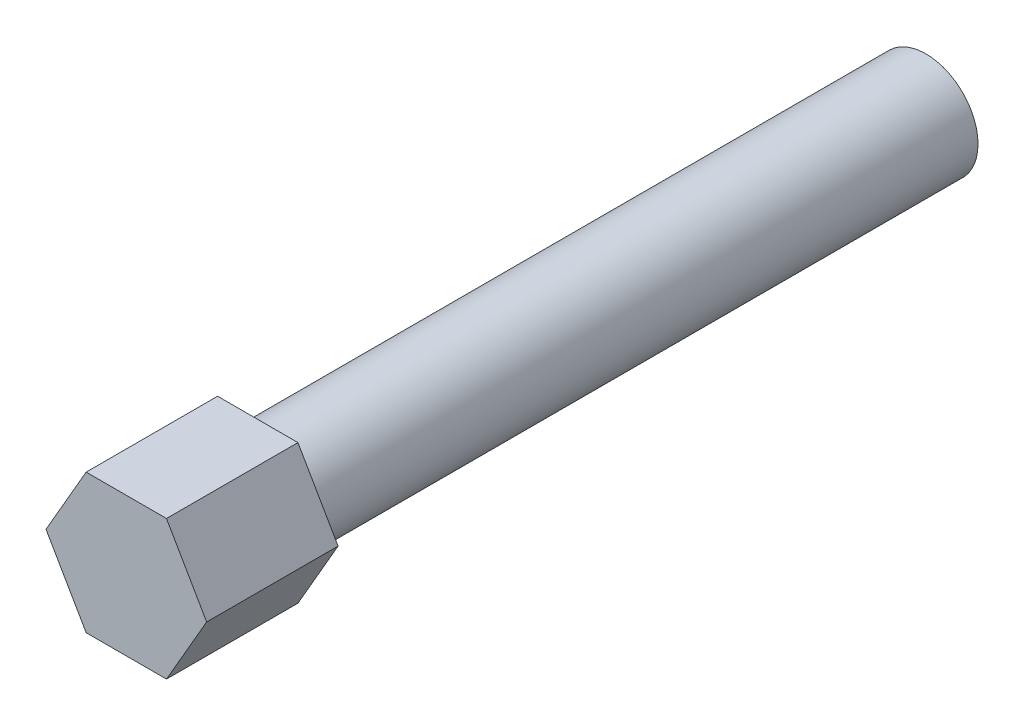
ISO-10303-21;
HEADER;
FILE_DESCRIPTION(('STEP AP214'),'2;1');
FILE_NAME('part.step','',(''),(''),'','','');
FILE_SCHEMA(('AUTOMOTIVE_DESIGN { 1 0 10303 214 1 1 1 1 }'));
ENDSEC;
DATA;
#1=APPLICATION_CONTEXT('core data for automotive mechanical design processes');
#2=APPLICATION_PROTOCOL_DEFINITION('international standard','automotive_design',2000,#1);
#3=PRODUCT_CONTEXT('',#1,'mechanical');
#4=PRODUCT('Part','Part','',(#3));
#5=PRODUCT_RELATED_PRODUCT_CATEGORY('part','',(#4));
#6=PRODUCT_DEFINITION_FORMATION('','',#4);
#7=PRODUCT_DEFINITION_CONTEXT('part definition',#1,'design');
#8=PRODUCT_DEFINITION('design','',#6,#7);
#9=PRODUCT_DEFINITION_SHAPE('','',#8);
#10=(LENGTH_UNIT() NAMED_UNIT(*) SI_UNIT(.MILLI.,.METRE.));
#11=(NAMED_UNIT(*) PLANE_ANGLE_UNIT() SI_UNIT($,.RADIAN.));
#12=(NAMED_UNIT(*) SI_UNIT($,.STERADIAN.) SOLID_ANGLE_UNIT());
#13=UNCERTAINTY_MEASURE_WITH_UNIT(LENGTH_MEASURE(1.E-05),#10,'distance_accuracy_value','');
#14=(GEOMETRIC_REPRESENTATION_CONTEXT(3) GLOBAL_UNCERTAINTY_ASSIGNED_CONTEXT((#13)) GLOBAL_UNIT_ASSIGNED_CONTEXT((#10,
#11,#12)) REPRESENTATION_CONTEXT('',''));
#15=CARTESIAN_POINT('',(0.,0.,0.));
#16=DIRECTION('',(0.,0.,1.));
#17=DIRECTION('',(1.,0.,0.));
#18=AXIS2_PLACEMENT_3D('',#15,#16,#17);
#19=CARTESIAN_POINT('',(-3.66617420935412,-6.35,12.));
#20=DIRECTION('',(0.,1.,0.));
#21=DIRECTION('',(-1.,0.,0.));
#22=AXIS2_PLACEMENT_3D('',#19,#20,#21);
#23=PLANE('',#22);
#24=DIRECTION('',(1.,0.,0.));
#25=VECTOR('',#24,1.);
#26=CARTESIAN_POINT('',(-3.66617420935412,-6.35,0.));
#27=LINE('',#26,#25);
#28=CARTESIAN_POINT('',(-3.66617420935412,-6.35,0.));
#29=VERTEX_POINT('',#28);
#30=CARTESIAN_POINT('',(3.66617420935412,-6.35,0.));
#31=VERTEX_POINT('',#30);
#32=EDGE_CURVE('E148',#29,#31,#27,.T.);
#33=ORIENTED_EDGE('',*,*,#32,.T.);
#34=DIRECTION('',(0.,0.,-1.));
#35=VECTOR('',#34,1.);
#36=CARTESIAN_POINT('',(3.66617420935412,-6.35,12.));
#37=LINE('',#36,#35);
#38=CARTESIAN_POINT('',(3.66617420935412,-6.35,12.));
#39=VERTEX_POINT('',#38);
#40=EDGE_CURVE('E48',#39,#31,#37,.T.);
#41=ORIENTED_EDGE('',*,*,#40,.F.);
#42=DIRECTION('',(1.,0.,0.));
#43=VECTOR('',#42,1.);
#44=CARTESIAN_POINT('',(-3.66617420935412,-6.35,12.));
#45=LINE('',#44,#43);
#46=CARTESIAN_POINT('',(-3.66617420935412,-6.35,12.));
#47=VERTEX_POINT('',#46);
#48=EDGE_CURVE('E166',#47,#39,#45,.T.);
#49=ORIENTED_EDGE('',*,*,#48,.F.);
#50=DIRECTION('',(0.,0.,-1.));
#51=VECTOR('',#50,1.);
#52=CARTESIAN_POINT('',(-3.66617420935412,-6.35,12.));
#53=LINE('',#52,#51);
#54=EDGE_CURVE('E144',#47,#29,#53,.T.);
#55=ORIENTED_EDGE('',*,*,#54,.T.);
#56=EDGE_LOOP('',(#33,#41,#49,#55));
#57=FACE_BOUND('',#56,.T.);
#58=ADVANCED_FACE('F45',(#57),#23,.F.);
#59=CARTESIAN_POINT('',(3.66617420935412,-6.35,12.));
#60=DIRECTION('',(-0.866025403784438,0.5,0.));
#61=DIRECTION('',(-0.5,-0.866025403784439,0.));
#62=AXIS2_PLACEMENT_3D('',#59,#60,#61);
#63=PLANE('',#62);
#64=DIRECTION('',(0.5,0.866025403784439,0.));
#65=VECTOR('',#64,1.);
#66=CARTESIAN_POINT('',(3.66617420935412,-6.35,0.));
#67=LINE('',#66,#65);
#68=CARTESIAN_POINT('',(7.33234841870825,0.,0.));
#69=VERTEX_POINT('',#68);
#70=EDGE_CURVE('E152',#31,#69,#67,.T.);
#71=ORIENTED_EDGE('',*,*,#70,.T.);
#72=DIRECTION('',(0.,0.,-1.));
#73=VECTOR('',#72,1.);
#74=CARTESIAN_POINT('',(7.33234841870825,0.,12.));
#75=LINE('',#74,#73);
#76=CARTESIAN_POINT('',(7.33234841870825,0.,12.));
#77=VERTEX_POINT('',#76);
#78=EDGE_CURVE('E172',#77,#69,#75,.T.);
#79=ORIENTED_EDGE('',*,*,#78,.F.);
#80=DIRECTION('',(0.5,0.866025403784439,0.));
#81=VECTOR('',#80,1.);
#82=CARTESIAN_POINT('',(3.66617420935412,-6.35,12.));
#83=LINE('',#82,#81);
#84=EDGE_CURVE('E106',#39,#77,#83,.T.);
#85=ORIENTED_EDGE('',*,*,#84,.F.);
#86=ORIENTED_EDGE('',*,*,#40,.T.);
#87=EDGE_LOOP('',(#71,#79,#85,#86));
#88=FACE_BOUND('',#87,.T.);
#89=ADVANCED_FACE('F179',(#88),#63,.F.);
#90=CARTESIAN_POINT('',(7.33234841870825,0.,12.));
#91=DIRECTION('',(-0.866025403784439,-0.5,0.));
#92=DIRECTION('',(0.5,-0.866025403784439,0.));
#93=AXIS2_PLACEMENT_3D('',#90,#91,#92);
#94=PLANE('',#93);
#95=DIRECTION('',(-0.5,0.866025403784439,0.));
#96=VECTOR('',#95,1.);
#97=CARTESIAN_POINT('',(7.33234841870825,0.,0.));
#98=LINE('',#97,#96);
#99=CARTESIAN_POINT('',(3.66617420935412,6.35,0.));
#100=VERTEX_POINT('',#99);
#101=EDGE_CURVE('E156',#69,#100,#98,.T.);
#102=ORIENTED_EDGE('',*,*,#101,.T.);
#103=DIRECTION('',(0.,0.,-1.));
#104=VECTOR('',#103,1.);
#105=CARTESIAN_POINT('',(3.66617420935412,6.35,12.));
#106=LINE('',#105,#104);
#107=CARTESIAN_POINT('',(3.66617420935412,6.35,12.));
#108=VERTEX_POINT('',#107);
#109=EDGE_CURVE('E137',#108,#100,#106,.T.);
#110=ORIENTED_EDGE('',*,*,#109,.F.);
#111=DIRECTION('',(-0.5,0.866025403784439,0.));
#112=VECTOR('',#111,1.);
#113=CARTESIAN_POINT('',(7.33234841870825,0.,12.));
#114=LINE('',#113,#112);
#115=EDGE_CURVE('E123',#77,#108,#114,.T.);
#116=ORIENTED_EDGE('',*,*,#115,.F.);
#117=ORIENTED_EDGE('',*,*,#78,.T.);
#118=EDGE_LOOP('',(#102,#110,#116,#117));
#119=FACE_BOUND('',#118,.T.);
#120=ADVANCED_FACE('F185',(#119),#94,.F.);
#121=CARTESIAN_POINT('',(3.66617420935412,6.35,12.));
#122=DIRECTION('',(0.,-1.,0.));
#123=DIRECTION('',(1.,0.,0.));
#124=AXIS2_PLACEMENT_3D('',#121,#122,#123);
#125=PLANE('',#124);
#126=DIRECTION('',(-1.,0.,0.));
#127=VECTOR('',#126,1.);
#128=CARTESIAN_POINT('',(3.66617420935412,6.35,0.));
#129=LINE('',#128,#127);
#130=CARTESIAN_POINT('',(-3.66617420935412,6.35,0.));
#131=VERTEX_POINT('',#130);
#132=EDGE_CURVE('E133',#100,#131,#129,.T.);
#133=ORIENTED_EDGE('',*,*,#132,.T.);
#134=DIRECTION('',(0.,0.,-1.));
#135=VECTOR('',#134,1.);
#136=CARTESIAN_POINT('',(-3.66617420935412,6.35,12.));
#137=LINE('',#136,#135);
#138=CARTESIAN_POINT('',(-3.66617420935412,6.35,12.));
#139=VERTEX_POINT('',#138);
#140=EDGE_CURVE('E130',#139,#131,#137,.T.);
#141=ORIENTED_EDGE('',*,*,#140,.F.);
#142=DIRECTION('',(-1.,0.,0.));
#143=VECTOR('',#142,1.);
#144=CARTESIAN_POINT('',(3.66617420935412,6.35,12.));
#145=LINE('',#144,#143);
#146=EDGE_CURVE('E116',#108,#139,#145,.T.);
#147=ORIENTED_EDGE('',*,*,#146,.F.);
#148=ORIENTED_EDGE('',*,*,#109,.T.);
#149=EDGE_LOOP('',(#133,#141,#147,#148));
#150=FACE_BOUND('',#149,.T.);
#151=ADVANCED_FACE('F131',(#150),#125,.F.);
#152=CARTESIAN_POINT('',(-3.66617420935412,6.35,12.));
#153=DIRECTION('',(0.866025403784439,-0.5,0.));
#154=DIRECTION('',(0.5,0.866025403784439,0.));
#155=AXIS2_PLACEMENT_3D('',#152,#153,#154);
#156=PLANE('',#155);
#157=DIRECTION('',(-0.5,-0.866025403784439,0.));
#158=VECTOR('',#157,1.);
#159=CARTESIAN_POINT('',(-3.66617420935412,6.35,0.));
#160=LINE('',#159,#158);
#161=CARTESIAN_POINT('',(-7.33234841870825,0.,0.));
#162=VERTEX_POINT('',#161);
#163=EDGE_CURVE('E161',#131,#162,#160,.T.);
#164=ORIENTED_EDGE('',*,*,#163,.T.);
#165=DIRECTION('',(0.,0.,-1.));
#166=VECTOR('',#165,1.);
#167=CARTESIAN_POINT('',(-7.33234841870825,0.,12.));
#168=LINE('',#167,#166);
#169=CARTESIAN_POINT('',(-7.33234841870825,0.,12.));
#170=VERTEX_POINT('',#169);
#171=EDGE_CURVE('E138',#170,#162,#168,.T.);
#172=ORIENTED_EDGE('',*,*,#171,.F.);
#173=DIRECTION('',(-0.5,-0.866025403784439,0.));
#174=VECTOR('',#173,1.);
#175=CARTESIAN_POINT('',(-3.66617420935412,6.35,12.));
#176=LINE('',#175,#174);
#177=EDGE_CURVE('E120',#139,#170,#176,.T.);
#178=ORIENTED_EDGE('',*,*,#177,.F.);
#179=ORIENTED_EDGE('',*,*,#140,.T.);
#180=EDGE_LOOP('',(#164,#172,#178,#179));
#181=FACE_BOUND('',#180,.T.);
#182=ADVANCED_FACE('F140',(#181),#156,.F.);
#183=CARTESIAN_POINT('',(-7.33234841870825,0.,12.));
#184=DIRECTION('',(0.866025403784439,0.5,0.));
#185=DIRECTION('',(-0.5,0.866025403784439,0.));
#186=AXIS2_PLACEMENT_3D('',#183,#184,#185);
#187=PLANE('',#186);
#188=DIRECTION('',(0.5,-0.866025403784439,0.));
#189=VECTOR('',#188,1.);
#190=CARTESIAN_POINT('',(-7.33234841870825,0.,0.));
#191=LINE('',#190,#189);
#192=EDGE_CURVE('E97',#162,#29,#191,.T.);
#193=ORIENTED_EDGE('',*,*,#192,.T.);
#194=ORIENTED_EDGE('',*,*,#54,.F.);
#195=DIRECTION('',(0.5,-0.866025403784439,0.));
#196=VECTOR('',#195,1.);
#197=CARTESIAN_POINT('',(-7.33234841870825,0.,12.));
#198=LINE('',#197,#196);
#199=EDGE_CURVE('E70',#170,#47,#198,.T.);
#200=ORIENTED_EDGE('',*,*,#199,.F.);
#201=ORIENTED_EDGE('',*,*,#171,.T.);
#202=EDGE_LOOP('',(#193,#194,#200,#201));
#203=FACE_BOUND('',#202,.T.);
#204=ADVANCED_FACE('F292',(#203),#187,.F.);
#205=CARTESIAN_POINT('',(0.,0.,12.));
#206=DIRECTION('',(0.,0.,1.));
#207=DIRECTION('',(1.,0.,0.));
#208=AXIS2_PLACEMENT_3D('',#205,#206,#207);
#209=PLANE('',#208);
#210=ORIENTED_EDGE('',*,*,#48,.T.);
#211=ORIENTED_EDGE('',*,*,#84,.T.);
#212=ORIENTED_EDGE('',*,*,#115,.T.);
#213=ORIENTED_EDGE('',*,*,#146,.T.);
#214=ORIENTED_EDGE('',*,*,#177,.T.);
#215=ORIENTED_EDGE('',*,*,#199,.T.);
#216=EDGE_LOOP('',(#210,#211,#212,#213,#214,#215));
#217=FACE_BOUND('',#216,.T.);
#218=ADVANCED_FACE('F118',(#217),#209,.T.);
#219=CARTESIAN_POINT('',(0.,0.,0.));
#220=DIRECTION('',(0.,0.,1.));
#221=DIRECTION('',(1.,0.,0.));
#222=AXIS2_PLACEMENT_3D('',#219,#220,#221);
#223=PLANE('',#222);
#224=CARTESIAN_POINT('',(0.,0.,0.));
#225=DIRECTION('',(0.,0.,-1.));
#226=DIRECTION('',(-1.,0.,0.));
#227=AXIS2_PLACEMENT_3D('',#224,#225,#226);
#228=CIRCLE('',#227,4.75);
#229=CARTESIAN_POINT('',(4.75,0.,0.));
#230=VERTEX_POINT('',#229);
#231=EDGE_CURVE('E11',#230,#230,#228,.T.);
#232=ORIENTED_EDGE('',*,*,#231,.F.);
#233=EDGE_LOOP('',(#232));
#234=FACE_BOUND('',#233,.T.);
#235=ORIENTED_EDGE('',*,*,#32,.F.);
#236=ORIENTED_EDGE('',*,*,#192,.F.);
#237=ORIENTED_EDGE('',*,*,#163,.F.);
#238=ORIENTED_EDGE('',*,*,#132,.F.);
#239=ORIENTED_EDGE('',*,*,#101,.F.);
#240=ORIENTED_EDGE('',*,*,#70,.F.);
#241=EDGE_LOOP('',(#235,#236,#237,#238,#239,#240));
#242=FACE_BOUND('',#241,.T.);
#243=ADVANCED_FACE('F184',(#234,#242),#223,.F.);
#244=CARTESIAN_POINT('',(0.,0.,-61.));
#245=DIRECTION('',(0.,0.,1.));
#246=DIRECTION('',(1.,0.,0.));
#247=AXIS2_PLACEMENT_3D('',#244,#245,#246);
#248=CYLINDRICAL_SURFACE('',#247,4.75);
#249=CARTESIAN_POINT('',(0.,0.,-61.));
#250=DIRECTION('',(0.,0.,-1.));
#251=DIRECTION('',(-1.,0.,0.));
#252=AXIS2_PLACEMENT_3D('',#249,#250,#251);
#253=CIRCLE('',#252,4.75);
#254=CARTESIAN_POINT('',(4.75,0.,-61.));
#255=VERTEX_POINT('',#254);
#256=EDGE_CURVE('E153',#255,#255,#253,.T.);
#257=CARTESIAN_POINT('',(4.75,0.,-61.));
#258=CARTESIAN_POINT('',(4.75,0.,-60.3645833333333));
#259=CARTESIAN_POINT('',(4.75,0.,-59.7291666666667));
#260=CARTESIAN_POINT('',(4.75,0.,-58.4583333333333));
#261=CARTESIAN_POINT('',(4.75,0.,-57.8229166666667));
#262=CARTESIAN_POINT('',(4.75,0.,-56.5520833333333));
#263=CARTESIAN_POINT('',(4.75,0.,-55.9166666666667));
#264=CARTESIAN_POINT('',(4.75,0.,-54.6458333333333));
#265=CARTESIAN_POINT('',(4.75,0.,-54.0104166666667));
#266=CARTESIAN_POINT('',(4.75,0.,-52.7395833333333));
#267=CARTESIAN_POINT('',(4.75,0.,-52.1041666666667));
#268=CARTESIAN_POINT('',(4.75,0.,-50.8333333333333));
#269=CARTESIAN_POINT('',(4.75,0.,-50.1979166666667));
#270=CARTESIAN_POINT('',(4.75,0.,-48.9270833333333));
#271=CARTESIAN_POINT('',(4.75,0.,-48.2916666666667));
#272=CARTESIAN_POINT('',(4.75,0.,-47.0208333333333));
#273=CARTESIAN_POINT('',(4.75,0.,-46.3854166666667));
#274=CARTESIAN_POINT('',(4.75,0.,-45.1145833333333));
#275=CARTESIAN_POINT('',(4.75,0.,-44.4791666666667));
#276=CARTESIAN_POINT('',(4.75,0.,-43.2083333333333));
#277=CARTESIAN_POINT('',(4.75,0.,-42.5729166666667));
#278=CARTESIAN_POINT('',(4.75,0.,-41.3020833333333));
#279=CARTESIAN_POINT('',(4.75,0.,-40.6666666666667));
#280=CARTESIAN_POINT('',(4.75,0.,-39.3958333333333));
#281=CARTESIAN_POINT('',(4.75,0.,-38.7604166666667));
#282=CARTESIAN_POINT('',(4.75,0.,-37.4895833333333));
#283=CARTESIAN_POINT('',(4.75,0.,-36.8541666666667));
#284=CARTESIAN_POINT('',(4.75,0.,-35.5833333333333));
#285=CARTESIAN_POINT('',(4.75,0.,-34.9479166666667));
#286=CARTESIAN_POINT('',(4.75,0.,-33.6770833333333));
#287=CARTESIAN_POINT('',(4.75,0.,-33.0416666666667));
#288=CARTESIAN_POINT('',(4.75,0.,-31.7708333333333));
#289=CARTESIAN_POINT('',(4.75,0.,-31.1354166666667));
#290=CARTESIAN_POINT('',(4.75,0.,-29.8645833333333));
#291=CARTESIAN_POINT('',(4.75,0.,-29.2291666666667));
#292=CARTESIAN_POINT('',(4.75,0.,-27.9583333333333));
#293=CARTESIAN_POINT('',(4.75,0.,-27.3229166666667));
#294=CARTESIAN_POINT('',(4.75,0.,-26.0520833333333));
#295=CARTESIAN_POINT('',(4.75,0.,-25.4166666666667));
#296=CARTESIAN_POINT('',(4.75,0.,-24.1458333333333));
#297=CARTESIAN_POINT('',(4.75,0.,-23.5104166666667));
#298=CARTESIAN_POINT('',(4.75,0.,-22.2395833333333));
#299=CARTESIAN_POINT('',(4.75,0.,-21.6041666666667));
#300=CARTESIAN_POINT('',(4.75,0.,-20.3333333333333));
#301=CARTESIAN_POINT('',(4.75,0.,-19.6979166666667));
#302=CARTESIAN_POINT('',(4.75,0.,-18.4270833333333));
#303=CARTESIAN_POINT('',(4.75,0.,-17.7916666666667));
#304=CARTESIAN_POINT('',(4.75,0.,-16.5208333333333));
#305=CARTESIAN_POINT('',(4.75,0.,-15.8854166666667));
#306=CARTESIAN_POINT('',(4.75,0.,-14.6145833333333));
#307=CARTESIAN_POINT('',(4.75,0.,-13.9791666666667));
#308=CARTESIAN_POINT('',(4.75,0.,-12.7083333333333));
#309=CARTESIAN_POINT('',(4.75,0.,-12.0729166666667));
#310=CARTESIAN_POINT('',(4.75,0.,-10.8020833333333));
#311=CARTESIAN_POINT('',(4.75,0.,-10.1666666666667));
#312=CARTESIAN_POINT('',(4.75,0.,-8.89583333333333));
#313=CARTESIAN_POINT('',(4.75,0.,-8.26041666666666));
#314=CARTESIAN_POINT('',(4.75,0.,-6.98958333333333));
#315=CARTESIAN_POINT('',(4.75,0.,-6.35416666666666));
#316=CARTESIAN_POINT('',(4.75,0.,-5.08333333333333));
#317=CARTESIAN_POINT('',(4.75,0.,-4.44791666666666));
#318=CARTESIAN_POINT('',(4.75,0.,-3.17708333333333));
#319=CARTESIAN_POINT('',(4.75,0.,-2.54166666666666));
#320=CARTESIAN_POINT('',(4.75,0.,-1.27083333333332));
#321=CARTESIAN_POINT('',(4.75,0.,-0.635416666666658));
#322=CARTESIAN_POINT('',(4.75,0.,0.));
#323=B_SPLINE_CURVE_WITH_KNOTS('',3,(#257,#258,#259,#260,#261,#262,#263,#264,#265,#266,#267,
#268,#269,#270,#271,#272,#273,#274,#275,#276,#277,#278,#279,#280,#281,#282,#283,#284,#285,#286,
#287,#288,#289,#290,#291,#292,#293,#294,#295,#296,#297,#298,#299,#300,#301,#302,#303,#304,#305,
#306,#307,#308,#309,#310,#311,#312,#313,#314,#315,#316,#317,#318,#319,#320,#321,#322),
.UNSPECIFIED.,.F.,.F.,(4,2,2,2,2,2,2,2,2,2,2,2,2,2,2,2,2,2,2,2,2,2,2,2,2,2,2,2,2,2,2,2,4),(0.,
1.90625000000001,3.8125,5.71875,7.62500000000001,9.53125000000001,11.4375,13.34375,15.25,
17.15625,19.0625,20.96875,22.875,24.78125,26.6875,28.59375,30.5,32.40625,34.3125,36.21875,
38.125,40.03125,41.9375,43.84375,45.75,47.65625,49.5625,51.46875,53.375,55.28125,57.1875,
59.09375,61.),.UNSPECIFIED.);
#324=EDGE_CURVE('BSEAM297',#255,#230,#323,.T.);
#325=ORIENTED_EDGE('',*,*,#256,.F.);
#326=ORIENTED_EDGE('',*,*,#231,.T.);
#327=ORIENTED_EDGE('',*,*,#324,.T.);
#328=ORIENTED_EDGE('',*,*,#324,.F.);
#329=EDGE_LOOP('',(#325,#327,#326,#328));
#330=FACE_BOUND('',#329,.T.);
#331=ADVANCED_FACE('F297',(#330),#248,.T.);
#332=CARTESIAN_POINT('',(0.,0.,-61.));
#333=DIRECTION('',(0.,0.,-1.));
#334=DIRECTION('',(-1.,0.,0.));
#335=AXIS2_PLACEMENT_3D('',#332,#333,#334);
#336=PLANE('',#335);
#337=CARTESIAN_POINT('',(0.,0.,-61.));
#338=DIRECTION('',(0.,0.,-1.));
#339=DIRECTION('',(-1.,0.,0.));
#340=AXIS2_PLACEMENT_3D('',#337,#338,#339);
#341=CIRCLE('',#340,4.);
#342=CARTESIAN_POINT('',(2.64575131106459,3.,-61.));
#343=VERTEX_POINT('',#342);
#344=CARTESIAN_POINT('',(2.64575131106459,-3.,-61.));
#345=VERTEX_POINT('',#344);
#346=EDGE_CURVE('E61',#343,#345,#341,.T.);
#347=ORIENTED_EDGE('',*,*,#346,.F.);
#348=DIRECTION('',(1.,0.,0.));
#349=VECTOR('',#348,1.);
#350=CARTESIAN_POINT('',(2.64575131106459,3.,-61.));
#351=LINE('',#350,#349);
#352=CARTESIAN_POINT('',(-2.64575131106459,3.,-61.));
#353=VERTEX_POINT('',#352);
#354=EDGE_CURVE('E210',#353,#343,#351,.T.);
#355=ORIENTED_EDGE('',*,*,#354,.F.);
#356=CARTESIAN_POINT('',(0.,0.,-61.));
#357=DIRECTION('',(0.,0.,-1.));
#358=DIRECTION('',(-1.,0.,0.));
#359=AXIS2_PLACEMENT_3D('',#356,#357,#358);
#360=CIRCLE('',#359,4.);
#361=CARTESIAN_POINT('',(-2.64575131106459,-3.,-61.));
#362=VERTEX_POINT('',#361);
#363=EDGE_CURVE('E215',#362,#353,#360,.T.);
#364=ORIENTED_EDGE('',*,*,#363,.F.);
#365=DIRECTION('',(-1.,0.,0.));
#366=VECTOR('',#365,1.);
#367=CARTESIAN_POINT('',(2.64575131106459,-3.,-61.));
#368=LINE('',#367,#366);
#369=EDGE_CURVE('E219',#345,#362,#368,.T.);
#370=ORIENTED_EDGE('',*,*,#369,.F.);
#371=EDGE_LOOP('',(#347,#355,#364,#370));
#372=FACE_BOUND('',#371,.T.);
#373=ORIENTED_EDGE('',*,*,#256,.T.);
#374=EDGE_LOOP('',(#373));
#375=FACE_BOUND('',#374,.T.);
#376=ADVANCED_FACE('F266',(#372,#375),#336,.T.);
#377=CARTESIAN_POINT('',(0.,0.,-47.));
#378=DIRECTION('',(0.,0.,-1.));
#379=DIRECTION('',(-1.,0.,0.));
#380=AXIS2_PLACEMENT_3D('',#377,#378,#379);
#381=CYLINDRICAL_SURFACE('',#380,4.);
#382=ORIENTED_EDGE('',*,*,#346,.T.);
#383=DIRECTION('',(0.,0.,-1.));
#384=VECTOR('',#383,1.);
#385=CARTESIAN_POINT('',(2.64575131106459,-3.,-47.));
#386=LINE('',#385,#384);
#387=CARTESIAN_POINT('',(2.64575131106459,-3.,-47.));
#388=VERTEX_POINT('',#387);
#389=EDGE_CURVE('E196',#388,#345,#386,.T.);
#390=ORIENTED_EDGE('',*,*,#389,.F.);
#391=CARTESIAN_POINT('',(0.,0.,-47.));
#392=DIRECTION('',(0.,0.,-1.));
#393=DIRECTION('',(-1.,0.,0.));
#394=AXIS2_PLACEMENT_3D('',#391,#392,#393);
#395=CIRCLE('',#394,4.);
#396=CARTESIAN_POINT('',(2.64575131106459,3.,-47.));
#397=VERTEX_POINT('',#396);
#398=EDGE_CURVE('E214',#397,#388,#395,.T.);
#399=ORIENTED_EDGE('',*,*,#398,.F.);
#400=DIRECTION('',(0.,0.,-1.));
#401=VECTOR('',#400,1.);
#402=CARTESIAN_POINT('',(2.64575131106459,3.,-47.));
#403=LINE('',#402,#401);
#404=EDGE_CURVE('E195',#397,#343,#403,.T.);
#405=ORIENTED_EDGE('',*,*,#404,.T.);
#406=EDGE_LOOP('',(#382,#390,#399,#405));
#407=FACE_BOUND('',#406,.T.);
#408=ADVANCED_FACE('F246',(#407),#381,.F.);
#409=CARTESIAN_POINT('',(2.64575131106459,3.,-47.));
#410=DIRECTION('',(0.,1.,0.));
#411=DIRECTION('',(0.,0.,1.));
#412=AXIS2_PLACEMENT_3D('',#409,#410,#411);
#413=PLANE('',#412);
#414=ORIENTED_EDGE('',*,*,#354,.T.);
#415=ORIENTED_EDGE('',*,*,#404,.F.);
#416=DIRECTION('',(1.,0.,0.));
#417=VECTOR('',#416,1.);
#418=CARTESIAN_POINT('',(2.64575131106459,3.,-47.));
#419=LINE('',#418,#417);
#420=CARTESIAN_POINT('',(-2.64575131106459,3.,-47.));
#421=VERTEX_POINT('',#420);
#422=EDGE_CURVE('E200',#421,#397,#419,.T.);
#423=ORIENTED_EDGE('',*,*,#422,.F.);
#424=DIRECTION('',(0.,0.,-1.));
#425=VECTOR('',#424,1.);
#426=CARTESIAN_POINT('',(-2.64575131106459,3.,-47.));
#427=LINE('',#426,#425);
#428=EDGE_CURVE('E204',#421,#353,#427,.T.);
#429=ORIENTED_EDGE('',*,*,#428,.T.);
#430=EDGE_LOOP('',(#414,#415,#423,#429));
#431=FACE_BOUND('',#430,.T.);
#432=ADVANCED_FACE('F257',(#431),#413,.F.);
#433=CARTESIAN_POINT('',(0.,0.,-47.));
#434=DIRECTION('',(0.,0.,-1.));
#435=DIRECTION('',(-1.,0.,0.));
#436=AXIS2_PLACEMENT_3D('',#433,#434,#435);
#437=CYLINDRICAL_SURFACE('',#436,4.);
#438=ORIENTED_EDGE('',*,*,#363,.T.);
#439=ORIENTED_EDGE('',*,*,#428,.F.);
#440=CARTESIAN_POINT('',(0.,0.,-47.));
#441=DIRECTION('',(0.,0.,-1.));
#442=DIRECTION('',(-1.,0.,0.));
#443=AXIS2_PLACEMENT_3D('',#440,#441,#442);
#444=CIRCLE('',#443,4.);
#445=CARTESIAN_POINT('',(-2.64575131106459,-3.,-47.));
#446=VERTEX_POINT('',#445);
#447=EDGE_CURVE('E228',#446,#421,#444,.T.);
#448=ORIENTED_EDGE('',*,*,#447,.F.);
#449=DIRECTION('',(0.,0.,-1.));
#450=VECTOR('',#449,1.);
#451=CARTESIAN_POINT('',(-2.64575131106459,-3.,-47.));
#452=LINE('',#451,#450);
#453=EDGE_CURVE('E199',#446,#362,#452,.T.);
#454=ORIENTED_EDGE('',*,*,#453,.T.);
#455=EDGE_LOOP('',(#438,#439,#448,#454));
#456=FACE_BOUND('',#455,.T.);
#457=ADVANCED_FACE('F262',(#456),#437,.F.);
#458=CARTESIAN_POINT('',(2.64575131106459,-3.,-47.));
#459=DIRECTION('',(0.,-1.,0.));
#460=DIRECTION('',(0.,0.,-1.));
#461=AXIS2_PLACEMENT_3D('',#458,#459,#460);
#462=PLANE('',#461);
#463=ORIENTED_EDGE('',*,*,#369,.T.);
#464=ORIENTED_EDGE('',*,*,#453,.F.);
#465=DIRECTION('',(-1.,0.,0.));
#466=VECTOR('',#465,1.);
#467=CARTESIAN_POINT('',(2.64575131106459,-3.,-47.));
#468=LINE('',#467,#466);
#469=EDGE_CURVE('E232',#388,#446,#468,.T.);
#470=ORIENTED_EDGE('',*,*,#469,.F.);
#471=ORIENTED_EDGE('',*,*,#389,.T.);
#472=EDGE_LOOP('',(#463,#464,#470,#471));
#473=FACE_BOUND('',#472,.T.);
#474=ADVANCED_FACE('F269',(#473),#462,.F.);
#475=CARTESIAN_POINT('',(0.,0.,-47.));
#476=DIRECTION('',(0.,0.,-1.));
#477=DIRECTION('',(-1.,0.,0.));
#478=AXIS2_PLACEMENT_3D('',#475,#476,#477);
#479=PLANE('',#478);
#480=ORIENTED_EDGE('',*,*,#398,.T.);
#481=ORIENTED_EDGE('',*,*,#469,.T.);
#482=ORIENTED_EDGE('',*,*,#447,.T.);
#483=ORIENTED_EDGE('',*,*,#422,.T.);
#484=EDGE_LOOP('',(#480,#481,#482,#483));
#485=FACE_BOUND('',#484,.T.);
#486=ADVANCED_FACE('F241',(#485),#479,.T.);
#487=CLOSED_SHELL('',(#58,#89,#120,#151,#182,#204,#218,#243,#331,#376,#408,#432,#457,#474,#486));
#488=MANIFOLD_SOLID_BREP('B2',#487);
#489=ADVANCED_BREP_SHAPE_REPRESENTATION('',(#18,#488),#14);
#490=SHAPE_DEFINITION_REPRESENTATION(#9,#489);
ENDSEC;
END-ISO-10303-21;
